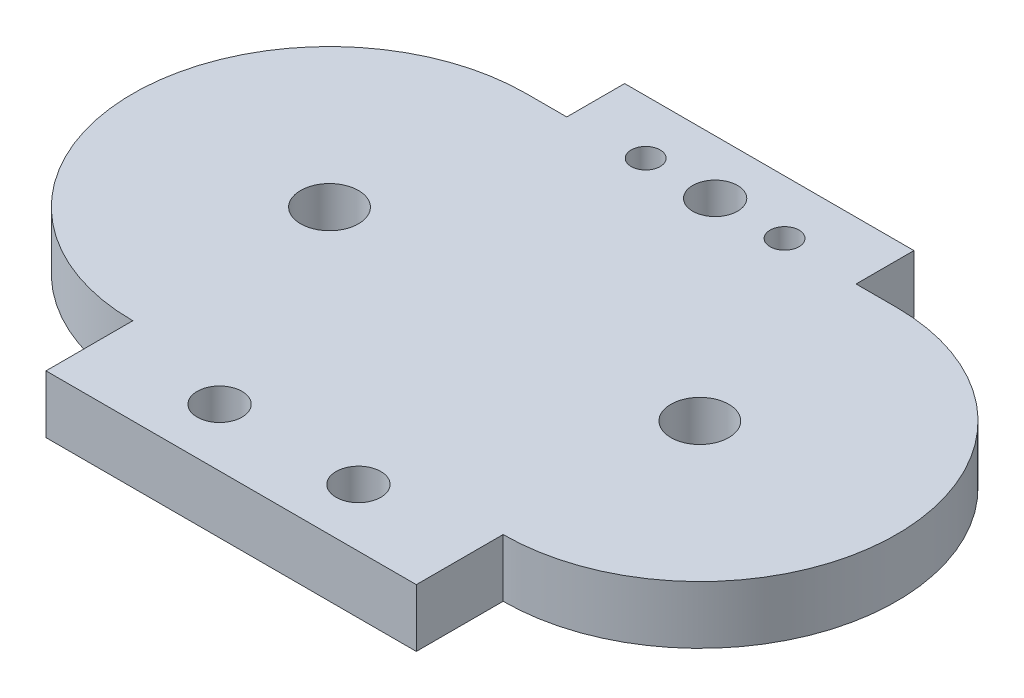
ISO-10303-21;
HEADER;
FILE_DESCRIPTION(('STEP AP214'),'2;1');
FILE_NAME('part.step','',(''),(''),'','','');
FILE_SCHEMA(('AUTOMOTIVE_DESIGN { 1 0 10303 214 1 1 1 1 }'));
ENDSEC;
DATA;
#1=APPLICATION_CONTEXT('core data for automotive mechanical design processes');
#2=APPLICATION_PROTOCOL_DEFINITION('international standard','automotive_design',2000,#1);
#3=PRODUCT_CONTEXT('',#1,'mechanical');
#4=PRODUCT('Part','Part','',(#3));
#5=PRODUCT_RELATED_PRODUCT_CATEGORY('part','',(#4));
#6=PRODUCT_DEFINITION_FORMATION('','',#4);
#7=PRODUCT_DEFINITION_CONTEXT('part definition',#1,'design');
#8=PRODUCT_DEFINITION('design','',#6,#7);
#9=PRODUCT_DEFINITION_SHAPE('','',#8);
#10=(LENGTH_UNIT() NAMED_UNIT(*) SI_UNIT(.MILLI.,.METRE.));
#11=(NAMED_UNIT(*) PLANE_ANGLE_UNIT() SI_UNIT($,.RADIAN.));
#12=(NAMED_UNIT(*) SI_UNIT($,.STERADIAN.) SOLID_ANGLE_UNIT());
#13=UNCERTAINTY_MEASURE_WITH_UNIT(LENGTH_MEASURE(1.E-05),#10,'distance_accuracy_value','');
#14=(GEOMETRIC_REPRESENTATION_CONTEXT(3) GLOBAL_UNCERTAINTY_ASSIGNED_CONTEXT((#13)) GLOBAL_UNIT_ASSIGNED_CONTEXT((#10,
#11,#12)) REPRESENTATION_CONTEXT('',''));
#15=CARTESIAN_POINT('',(0.,0.,0.));
#16=DIRECTION('',(0.,0.,1.));
#17=DIRECTION('',(1.,0.,0.));
#18=AXIS2_PLACEMENT_3D('',#15,#16,#17);
#19=CARTESIAN_POINT('',(20.32,6.35,0.));
#20=DIRECTION('',(0.,-1.,0.));
#21=DIRECTION('',(0.,0.,-1.));
#22=AXIS2_PLACEMENT_3D('',#19,#20,#21);
#23=CYLINDRICAL_SURFACE('',#22,21.59);
#24=CARTESIAN_POINT('',(20.32,0.,0.));
#25=DIRECTION('',(0.,1.,0.));
#26=DIRECTION('',(0.,0.,1.));
#27=AXIS2_PLACEMENT_3D('',#24,#25,#26);
#28=CIRCLE('',#27,21.59);
#29=CARTESIAN_POINT('',(20.32,0.,-21.59));
#30=VERTEX_POINT('',#29);
#31=CARTESIAN_POINT('',(20.32,0.,21.59));
#32=VERTEX_POINT('',#31);
#33=EDGE_CURVE('E173',#30,#32,#28,.F.);
#34=ORIENTED_EDGE('',*,*,#33,.F.);
#35=DIRECTION('',(0.,-1.,0.));
#36=VECTOR('',#35,1.);
#37=CARTESIAN_POINT('',(20.32,6.35,-21.59));
#38=LINE('',#37,#36);
#39=CARTESIAN_POINT('',(20.32,6.35,-21.59));
#40=VERTEX_POINT('',#39);
#41=EDGE_CURVE('E11',#40,#30,#38,.T.);
#42=ORIENTED_EDGE('',*,*,#41,.F.);
#43=CARTESIAN_POINT('',(20.32,6.35,0.));
#44=DIRECTION('',(0.,1.,0.));
#45=DIRECTION('',(0.,0.,1.));
#46=AXIS2_PLACEMENT_3D('',#43,#44,#45);
#47=CIRCLE('',#46,21.59);
#48=CARTESIAN_POINT('',(20.32,6.35,21.59));
#49=VERTEX_POINT('',#48);
#50=EDGE_CURVE('E223',#40,#49,#47,.F.);
#51=ORIENTED_EDGE('',*,*,#50,.T.);
#52=DIRECTION('',(0.,-1.,0.));
#53=VECTOR('',#52,1.);
#54=CARTESIAN_POINT('',(20.32,6.35,21.59));
#55=LINE('',#54,#53);
#56=EDGE_CURVE('E103',#49,#32,#55,.T.);
#57=ORIENTED_EDGE('',*,*,#56,.T.);
#58=EDGE_LOOP('',(#34,#42,#51,#57));
#59=FACE_BOUND('',#58,.T.);
#60=ADVANCED_FACE('F45',(#59),#23,.T.);
#61=CARTESIAN_POINT('',(0.,6.35,-21.59));
#62=DIRECTION('',(0.,0.,1.));
#63=DIRECTION('',(1.,0.,0.));
#64=AXIS2_PLACEMENT_3D('',#61,#62,#63);
#65=PLANE('',#64);
#66=DIRECTION('',(-1.,0.,0.));
#67=VECTOR('',#66,1.);
#68=CARTESIAN_POINT('',(0.,0.,-21.59));
#69=LINE('',#68,#67);
#70=CARTESIAN_POINT('',(15.875,0.,-21.59));
#71=VERTEX_POINT('',#70);
#72=EDGE_CURVE('E177',#30,#71,#69,.T.);
#73=ORIENTED_EDGE('',*,*,#72,.T.);
#74=DIRECTION('',(0.,-1.,0.));
#75=VECTOR('',#74,1.);
#76=CARTESIAN_POINT('',(15.875,6.35,-21.59));
#77=LINE('',#76,#75);
#78=CARTESIAN_POINT('',(15.875,6.35,-21.59));
#79=VERTEX_POINT('',#78);
#80=EDGE_CURVE('E54',#79,#71,#77,.T.);
#81=ORIENTED_EDGE('',*,*,#80,.F.);
#82=DIRECTION('',(-1.,0.,0.));
#83=VECTOR('',#82,1.);
#84=CARTESIAN_POINT('',(0.,6.35,-21.59));
#85=LINE('',#84,#83);
#86=EDGE_CURVE('E271',#40,#79,#85,.T.);
#87=ORIENTED_EDGE('',*,*,#86,.F.);
#88=ORIENTED_EDGE('',*,*,#41,.T.);
#89=EDGE_LOOP('',(#73,#81,#87,#88));
#90=FACE_BOUND('',#89,.T.);
#91=ADVANCED_FACE('F295',(#90),#65,.F.);
#92=CARTESIAN_POINT('',(15.875,6.35,0.));
#93=DIRECTION('',(-1.,0.,0.));
#94=DIRECTION('',(0.,0.,1.));
#95=AXIS2_PLACEMENT_3D('',#92,#93,#94);
#96=PLANE('',#95);
#97=DIRECTION('',(0.,0.,-1.));
#98=VECTOR('',#97,1.);
#99=CARTESIAN_POINT('',(15.875,0.,0.));
#100=LINE('',#99,#98);
#101=CARTESIAN_POINT('',(15.875,0.,-27.94));
#102=VERTEX_POINT('',#101);
#103=EDGE_CURVE('E181',#71,#102,#100,.T.);
#104=ORIENTED_EDGE('',*,*,#103,.T.);
#105=DIRECTION('',(0.,-1.,0.));
#106=VECTOR('',#105,1.);
#107=CARTESIAN_POINT('',(15.875,6.35,-27.94));
#108=LINE('',#107,#106);
#109=CARTESIAN_POINT('',(15.875,6.35,-27.94));
#110=VERTEX_POINT('',#109);
#111=EDGE_CURVE('E239',#110,#102,#108,.T.);
#112=ORIENTED_EDGE('',*,*,#111,.F.);
#113=DIRECTION('',(0.,0.,-1.));
#114=VECTOR('',#113,1.);
#115=CARTESIAN_POINT('',(15.875,6.35,0.));
#116=LINE('',#115,#114);
#117=EDGE_CURVE('E249',#79,#110,#116,.T.);
#118=ORIENTED_EDGE('',*,*,#117,.F.);
#119=ORIENTED_EDGE('',*,*,#80,.T.);
#120=EDGE_LOOP('',(#104,#112,#118,#119));
#121=FACE_BOUND('',#120,.T.);
#122=ADVANCED_FACE('F247',(#121),#96,.F.);
#123=CARTESIAN_POINT('',(0.,6.35,-27.94));
#124=DIRECTION('',(0.,0.,-1.));
#125=DIRECTION('',(-1.,0.,0.));
#126=AXIS2_PLACEMENT_3D('',#123,#124,#125);
#127=PLANE('',#126);
#128=DIRECTION('',(1.,0.,0.));
#129=VECTOR('',#128,1.);
#130=CARTESIAN_POINT('',(0.,0.,-27.94));
#131=LINE('',#130,#129);
#132=CARTESIAN_POINT('',(-15.875,0.,-27.94));
#133=VERTEX_POINT('',#132);
#134=EDGE_CURVE('E185',#133,#102,#131,.T.);
#135=ORIENTED_EDGE('',*,*,#134,.F.);
#136=DIRECTION('',(0.,-1.,0.));
#137=VECTOR('',#136,1.);
#138=CARTESIAN_POINT('',(-15.875,6.35,-27.94));
#139=LINE('',#138,#137);
#140=CARTESIAN_POINT('',(-15.875,6.35,-27.94));
#141=VERTEX_POINT('',#140);
#142=EDGE_CURVE('E236',#141,#133,#139,.T.);
#143=ORIENTED_EDGE('',*,*,#142,.F.);
#144=DIRECTION('',(1.,0.,0.));
#145=VECTOR('',#144,1.);
#146=CARTESIAN_POINT('',(0.,6.35,-27.94));
#147=LINE('',#146,#145);
#148=EDGE_CURVE('E261',#141,#110,#147,.T.);
#149=ORIENTED_EDGE('',*,*,#148,.T.);
#150=ORIENTED_EDGE('',*,*,#111,.T.);
#151=EDGE_LOOP('',(#135,#143,#149,#150));
#152=FACE_BOUND('',#151,.T.);
#153=ADVANCED_FACE('F258',(#152),#127,.T.);
#154=CARTESIAN_POINT('',(-15.875,6.35,0.));
#155=DIRECTION('',(-1.,0.,0.));
#156=DIRECTION('',(0.,0.,1.));
#157=AXIS2_PLACEMENT_3D('',#154,#155,#156);
#158=PLANE('',#157);
#159=DIRECTION('',(0.,0.,-1.));
#160=VECTOR('',#159,1.);
#161=CARTESIAN_POINT('',(-15.875,0.,0.));
#162=LINE('',#161,#160);
#163=CARTESIAN_POINT('',(-15.875,0.,-21.59));
#164=VERTEX_POINT('',#163);
#165=EDGE_CURVE('E189',#164,#133,#162,.T.);
#166=ORIENTED_EDGE('',*,*,#165,.F.);
#167=DIRECTION('',(0.,-1.,0.));
#168=VECTOR('',#167,1.);
#169=CARTESIAN_POINT('',(-15.875,6.35,-21.59));
#170=LINE('',#169,#168);
#171=CARTESIAN_POINT('',(-15.875,6.35,-21.59));
#172=VERTEX_POINT('',#171);
#173=EDGE_CURVE('E233',#172,#164,#170,.T.);
#174=ORIENTED_EDGE('',*,*,#173,.F.);
#175=DIRECTION('',(0.,0.,-1.));
#176=VECTOR('',#175,1.);
#177=CARTESIAN_POINT('',(-15.875,6.35,0.));
#178=LINE('',#177,#176);
#179=EDGE_CURVE('E265',#172,#141,#178,.T.);
#180=ORIENTED_EDGE('',*,*,#179,.T.);
#181=ORIENTED_EDGE('',*,*,#142,.T.);
#182=EDGE_LOOP('',(#166,#174,#180,#181));
#183=FACE_BOUND('',#182,.T.);
#184=ADVANCED_FACE('F282',(#183),#158,.T.);
#185=CARTESIAN_POINT('',(0.,6.35,-21.59));
#186=DIRECTION('',(0.,0.,-1.));
#187=DIRECTION('',(-1.,0.,0.));
#188=AXIS2_PLACEMENT_3D('',#185,#186,#187);
#189=PLANE('',#188);
#190=DIRECTION('',(1.,0.,0.));
#191=VECTOR('',#190,1.);
#192=CARTESIAN_POINT('',(0.,0.,-21.59));
#193=LINE('',#192,#191);
#194=CARTESIAN_POINT('',(-20.32,0.,-21.59));
#195=VERTEX_POINT('',#194);
#196=EDGE_CURVE('E193',#195,#164,#193,.T.);
#197=ORIENTED_EDGE('',*,*,#196,.F.);
#198=DIRECTION('',(0.,-1.,0.));
#199=VECTOR('',#198,1.);
#200=CARTESIAN_POINT('',(-20.32,6.35,-21.59));
#201=LINE('',#200,#199);
#202=CARTESIAN_POINT('',(-20.32,6.35,-21.59));
#203=VERTEX_POINT('',#202);
#204=EDGE_CURVE('E230',#203,#195,#201,.T.);
#205=ORIENTED_EDGE('',*,*,#204,.F.);
#206=DIRECTION('',(1.,0.,0.));
#207=VECTOR('',#206,1.);
#208=CARTESIAN_POINT('',(0.,6.35,-21.59));
#209=LINE('',#208,#207);
#210=EDGE_CURVE('E269',#203,#172,#209,.T.);
#211=ORIENTED_EDGE('',*,*,#210,.T.);
#212=ORIENTED_EDGE('',*,*,#173,.T.);
#213=EDGE_LOOP('',(#197,#205,#211,#212));
#214=FACE_BOUND('',#213,.T.);
#215=ADVANCED_FACE('F280',(#214),#189,.T.);
#216=CARTESIAN_POINT('',(-20.32,6.35,0.));
#217=DIRECTION('',(0.,-1.,0.));
#218=DIRECTION('',(0.,0.,-1.));
#219=AXIS2_PLACEMENT_3D('',#216,#217,#218);
#220=CYLINDRICAL_SURFACE('',#219,21.59);
#221=CARTESIAN_POINT('',(-20.32,0.,0.));
#222=DIRECTION('',(0.,1.,0.));
#223=DIRECTION('',(0.,0.,1.));
#224=AXIS2_PLACEMENT_3D('',#221,#222,#223);
#225=CIRCLE('',#224,21.59);
#226=CARTESIAN_POINT('',(-20.32,0.,21.59));
#227=VERTEX_POINT('',#226);
#228=EDGE_CURVE('E197',#195,#227,#225,.T.);
#229=ORIENTED_EDGE('',*,*,#228,.T.);
#230=DIRECTION('',(0.,-1.,0.));
#231=VECTOR('',#230,1.);
#232=CARTESIAN_POINT('',(-20.32,6.35,21.59));
#233=LINE('',#232,#231);
#234=CARTESIAN_POINT('',(-20.32,6.35,21.59));
#235=VERTEX_POINT('',#234);
#236=EDGE_CURVE('E147',#235,#227,#233,.T.);
#237=ORIENTED_EDGE('',*,*,#236,.F.);
#238=CARTESIAN_POINT('',(-20.32,6.35,0.));
#239=DIRECTION('',(0.,1.,0.));
#240=DIRECTION('',(0.,0.,1.));
#241=AXIS2_PLACEMENT_3D('',#238,#239,#240);
#242=CIRCLE('',#241,21.59);
#243=EDGE_CURVE('E136',#203,#235,#242,.T.);
#244=ORIENTED_EDGE('',*,*,#243,.F.);
#245=ORIENTED_EDGE('',*,*,#204,.T.);
#246=EDGE_LOOP('',(#229,#237,#244,#245));
#247=FACE_BOUND('',#246,.T.);
#248=ADVANCED_FACE('F285',(#247),#220,.T.);
#249=CARTESIAN_POINT('',(-20.32,6.35,0.));
#250=DIRECTION('',(1.,0.,0.));
#251=DIRECTION('',(0.,0.,-1.));
#252=AXIS2_PLACEMENT_3D('',#249,#250,#251);
#253=PLANE('',#252);
#254=DIRECTION('',(0.,0.,1.));
#255=VECTOR('',#254,1.);
#256=CARTESIAN_POINT('',(-20.32,0.,0.));
#257=LINE('',#256,#255);
#258=CARTESIAN_POINT('',(-20.32,0.,31.115));
#259=VERTEX_POINT('',#258);
#260=EDGE_CURVE('E145',#227,#259,#257,.T.);
#261=ORIENTED_EDGE('',*,*,#260,.T.);
#262=DIRECTION('',(0.,-1.,0.));
#263=VECTOR('',#262,1.);
#264=CARTESIAN_POINT('',(-20.32,6.35,31.115));
#265=LINE('',#264,#263);
#266=CARTESIAN_POINT('',(-20.32,6.35,31.115));
#267=VERTEX_POINT('',#266);
#268=EDGE_CURVE('E142',#267,#259,#265,.T.);
#269=ORIENTED_EDGE('',*,*,#268,.F.);
#270=DIRECTION('',(0.,0.,1.));
#271=VECTOR('',#270,1.);
#272=CARTESIAN_POINT('',(-20.32,6.35,0.));
#273=LINE('',#272,#271);
#274=EDGE_CURVE('E128',#235,#267,#273,.T.);
#275=ORIENTED_EDGE('',*,*,#274,.F.);
#276=ORIENTED_EDGE('',*,*,#236,.T.);
#277=EDGE_LOOP('',(#261,#269,#275,#276));
#278=FACE_BOUND('',#277,.T.);
#279=ADVANCED_FACE('F143',(#278),#253,.F.);
#280=CARTESIAN_POINT('',(0.,6.35,31.115));
#281=DIRECTION('',(0.,0.,-1.));
#282=DIRECTION('',(-1.,0.,0.));
#283=AXIS2_PLACEMENT_3D('',#280,#281,#282);
#284=PLANE('',#283);
#285=DIRECTION('',(1.,0.,0.));
#286=VECTOR('',#285,1.);
#287=CARTESIAN_POINT('',(0.,0.,31.115));
#288=LINE('',#287,#286);
#289=CARTESIAN_POINT('',(20.32,0.,31.115));
#290=VERTEX_POINT('',#289);
#291=EDGE_CURVE('E96',#259,#290,#288,.T.);
#292=ORIENTED_EDGE('',*,*,#291,.T.);
#293=DIRECTION('',(0.,-1.,0.));
#294=VECTOR('',#293,1.);
#295=CARTESIAN_POINT('',(20.32,6.35,31.115));
#296=LINE('',#295,#294);
#297=CARTESIAN_POINT('',(20.32,6.35,31.115));
#298=VERTEX_POINT('',#297);
#299=EDGE_CURVE('E148',#298,#290,#296,.T.);
#300=ORIENTED_EDGE('',*,*,#299,.F.);
#301=DIRECTION('',(1.,0.,0.));
#302=VECTOR('',#301,1.);
#303=CARTESIAN_POINT('',(0.,6.35,31.115));
#304=LINE('',#303,#302);
#305=EDGE_CURVE('E133',#267,#298,#304,.T.);
#306=ORIENTED_EDGE('',*,*,#305,.F.);
#307=ORIENTED_EDGE('',*,*,#268,.T.);
#308=EDGE_LOOP('',(#292,#300,#306,#307));
#309=FACE_BOUND('',#308,.T.);
#310=ADVANCED_FACE('F150',(#309),#284,.F.);
#311=CARTESIAN_POINT('',(20.32,6.35,0.));
#312=DIRECTION('',(0.,-1.,0.));
#313=DIRECTION('',(0.,0.,-1.));
#314=AXIS2_PLACEMENT_3D('',#311,#312,#313);
#315=CYLINDRICAL_SURFACE('',#314,3.175);
#316=CARTESIAN_POINT('',(20.32,6.35,0.));
#317=DIRECTION('',(0.,1.,0.));
#318=DIRECTION('',(0.,0.,1.));
#319=AXIS2_PLACEMENT_3D('',#316,#317,#318);
#320=CIRCLE('',#319,3.175);
#321=CARTESIAN_POINT('',(20.32,6.35,3.175));
#322=VERTEX_POINT('',#321);
#323=EDGE_CURVE('E165',#322,#322,#320,.T.);
#324=ORIENTED_EDGE('',*,*,#323,.T.);
#325=EDGE_LOOP('',(#324));
#326=FACE_BOUND('',#325,.T.);
#327=CARTESIAN_POINT('',(20.32,0.,0.));
#328=DIRECTION('',(0.,1.,0.));
#329=DIRECTION('',(0.,0.,1.));
#330=AXIS2_PLACEMENT_3D('',#327,#328,#329);
#331=CIRCLE('',#330,3.175);
#332=CARTESIAN_POINT('',(20.32,0.,3.175));
#333=VERTEX_POINT('',#332);
#334=EDGE_CURVE('E215',#333,#333,#331,.T.);
#335=ORIENTED_EDGE('',*,*,#334,.F.);
#336=EDGE_LOOP('',(#335));
#337=FACE_BOUND('',#336,.T.);
#338=ADVANCED_FACE('F359',(#326,#337),#315,.F.);
#339=CARTESIAN_POINT('',(7.61999999999991,6.35,-21.9970452561247));
#340=DIRECTION('',(0.,-1.,0.));
#341=DIRECTION('',(0.,0.,-1.));
#342=AXIS2_PLACEMENT_3D('',#339,#340,#341);
#343=CYLINDRICAL_SURFACE('',#342,1.5875);
#344=CARTESIAN_POINT('',(7.61999999999991,6.35,-21.9970452561247));
#345=DIRECTION('',(0.,1.,0.));
#346=DIRECTION('',(0.,0.,1.));
#347=AXIS2_PLACEMENT_3D('',#344,#345,#346);
#348=CIRCLE('',#347,1.5875);
#349=CARTESIAN_POINT('',(7.61999999999991,6.35,-20.4095452561247));
#350=VERTEX_POINT('',#349);
#351=EDGE_CURVE('E161',#350,#350,#348,.T.);
#352=ORIENTED_EDGE('',*,*,#351,.T.);
#353=EDGE_LOOP('',(#352));
#354=FACE_BOUND('',#353,.T.);
#355=CARTESIAN_POINT('',(7.61999999999991,0.,-21.9970452561247));
#356=DIRECTION('',(0.,1.,0.));
#357=DIRECTION('',(0.,0.,1.));
#358=AXIS2_PLACEMENT_3D('',#355,#356,#357);
#359=CIRCLE('',#358,1.5875);
#360=CARTESIAN_POINT('',(7.61999999999991,0.,-20.4095452561247));
#361=VERTEX_POINT('',#360);
#362=EDGE_CURVE('E211',#361,#361,#359,.T.);
#363=ORIENTED_EDGE('',*,*,#362,.F.);
#364=EDGE_LOOP('',(#363));
#365=FACE_BOUND('',#364,.T.);
#366=ADVANCED_FACE('F362',(#354,#365),#343,.F.);
#367=CARTESIAN_POINT('',(-20.32,6.35,0.));
#368=DIRECTION('',(0.,-1.,0.));
#369=DIRECTION('',(0.,0.,-1.));
#370=AXIS2_PLACEMENT_3D('',#367,#368,#369);
#371=CYLINDRICAL_SURFACE('',#370,3.175);
#372=CARTESIAN_POINT('',(-20.32,6.35,0.));
#373=DIRECTION('',(0.,1.,0.));
#374=DIRECTION('',(0.,0.,1.));
#375=AXIS2_PLACEMENT_3D('',#372,#373,#374);
#376=CIRCLE('',#375,3.175);
#377=CARTESIAN_POINT('',(-20.32,6.35,3.17500000000001));
#378=VERTEX_POINT('',#377);
#379=EDGE_CURVE('E154',#378,#378,#376,.F.);
#380=ORIENTED_EDGE('',*,*,#379,.F.);
#381=EDGE_LOOP('',(#380));
#382=FACE_BOUND('',#381,.T.);
#383=CARTESIAN_POINT('',(-20.32,0.,0.));
#384=DIRECTION('',(0.,1.,0.));
#385=DIRECTION('',(0.,0.,1.));
#386=AXIS2_PLACEMENT_3D('',#383,#384,#385);
#387=CIRCLE('',#386,3.175);
#388=CARTESIAN_POINT('',(-20.32,0.,3.17500000000001));
#389=VERTEX_POINT('',#388);
#390=EDGE_CURVE('E207',#389,#389,#387,.F.);
#391=ORIENTED_EDGE('',*,*,#390,.T.);
#392=EDGE_LOOP('',(#391));
#393=FACE_BOUND('',#392,.T.);
#394=ADVANCED_FACE('F366',(#382,#393),#371,.F.);
#395=CARTESIAN_POINT('',(20.32,6.35,0.));
#396=DIRECTION('',(-1.,0.,0.));
#397=DIRECTION('',(0.,0.,1.));
#398=AXIS2_PLACEMENT_3D('',#395,#396,#397);
#399=PLANE('',#398);
#400=DIRECTION('',(0.,0.,-1.));
#401=VECTOR('',#400,1.);
#402=CARTESIAN_POINT('',(20.32,0.,0.));
#403=LINE('',#402,#401);
#404=EDGE_CURVE('E204',#290,#32,#403,.T.);
#405=ORIENTED_EDGE('',*,*,#404,.T.);
#406=ORIENTED_EDGE('',*,*,#56,.F.);
#407=DIRECTION('',(0.,0.,-1.));
#408=VECTOR('',#407,1.);
#409=CARTESIAN_POINT('',(20.32,6.35,0.));
#410=LINE('',#409,#408);
#411=EDGE_CURVE('E62',#298,#49,#410,.T.);
#412=ORIENTED_EDGE('',*,*,#411,.F.);
#413=ORIENTED_EDGE('',*,*,#299,.T.);
#414=EDGE_LOOP('',(#405,#406,#412,#413));
#415=FACE_BOUND('',#414,.T.);
#416=ADVANCED_FACE('F301',(#415),#399,.F.);
#417=CARTESIAN_POINT('',(-7.6199999999999,6.35,-21.9970452561247));
#418=DIRECTION('',(0.,-1.,0.));
#419=DIRECTION('',(0.,0.,-1.));
#420=AXIS2_PLACEMENT_3D('',#417,#418,#419);
#421=CYLINDRICAL_SURFACE('',#420,1.5875);
#422=CARTESIAN_POINT('',(-7.6199999999999,6.35,-21.9970452561247));
#423=DIRECTION('',(0.,1.,0.));
#424=DIRECTION('',(0.,0.,1.));
#425=AXIS2_PLACEMENT_3D('',#422,#423,#424);
#426=CIRCLE('',#425,1.5875);
#427=CARTESIAN_POINT('',(-7.6199999999999,6.35,-20.4095452561247));
#428=VERTEX_POINT('',#427);
#429=EDGE_CURVE('E169',#428,#428,#426,.F.);
#430=ORIENTED_EDGE('',*,*,#429,.F.);
#431=EDGE_LOOP('',(#430));
#432=FACE_BOUND('',#431,.T.);
#433=CARTESIAN_POINT('',(-7.6199999999999,0.,-21.9970452561247));
#434=DIRECTION('',(0.,1.,0.));
#435=DIRECTION('',(0.,0.,1.));
#436=AXIS2_PLACEMENT_3D('',#433,#434,#435);
#437=CIRCLE('',#436,1.5875);
#438=CARTESIAN_POINT('',(-7.6199999999999,0.,-20.4095452561247));
#439=VERTEX_POINT('',#438);
#440=EDGE_CURVE('E219',#439,#439,#437,.F.);
#441=ORIENTED_EDGE('',*,*,#440,.T.);
#442=EDGE_LOOP('',(#441));
#443=FACE_BOUND('',#442,.T.);
#444=ADVANCED_FACE('F334',(#432,#443),#421,.F.);
#445=CARTESIAN_POINT('',(0.,6.35,0.));
#446=DIRECTION('',(0.,1.,0.));
#447=DIRECTION('',(0.,0.,1.));
#448=AXIS2_PLACEMENT_3D('',#445,#446,#447);
#449=PLANE('',#448);
#450=CARTESIAN_POINT('',(0.,6.35,-21.9970452561247));
#451=DIRECTION('',(0.,1.,0.));
#452=DIRECTION('',(0.,0.,1.));
#453=AXIS2_PLACEMENT_3D('',#450,#451,#452);
#454=CIRCLE('',#453,2.45745);
#455=CARTESIAN_POINT('',(0.,6.35,-19.5395952561247));
#456=VERTEX_POINT('',#455);
#457=EDGE_CURVE('E325',#456,#456,#454,.T.);
#458=ORIENTED_EDGE('',*,*,#457,.F.);
#459=EDGE_LOOP('',(#458));
#460=FACE_BOUND('',#459,.T.);
#461=CARTESIAN_POINT('',(-7.6199999999999,6.35,24.765));
#462=DIRECTION('',(0.,1.,0.));
#463=DIRECTION('',(0.,0.,1.));
#464=AXIS2_PLACEMENT_3D('',#461,#462,#463);
#465=CIRCLE('',#464,2.45745);
#466=CARTESIAN_POINT('',(-7.6199999999999,6.35,27.22245));
#467=VERTEX_POINT('',#466);
#468=EDGE_CURVE('E317',#467,#467,#465,.T.);
#469=ORIENTED_EDGE('',*,*,#468,.F.);
#470=EDGE_LOOP('',(#469));
#471=FACE_BOUND('',#470,.T.);
#472=CARTESIAN_POINT('',(7.61999999999991,6.35,24.765));
#473=DIRECTION('',(0.,1.,0.));
#474=DIRECTION('',(0.,0.,1.));
#475=AXIS2_PLACEMENT_3D('',#472,#473,#474);
#476=CIRCLE('',#475,2.45745);
#477=CARTESIAN_POINT('',(7.61999999999991,6.35,27.22245));
#478=VERTEX_POINT('',#477);
#479=EDGE_CURVE('E309',#478,#478,#476,.T.);
#480=ORIENTED_EDGE('',*,*,#479,.F.);
#481=EDGE_LOOP('',(#480));
#482=FACE_BOUND('',#481,.T.);
#483=ORIENTED_EDGE('',*,*,#50,.F.);
#484=ORIENTED_EDGE('',*,*,#86,.T.);
#485=ORIENTED_EDGE('',*,*,#117,.T.);
#486=ORIENTED_EDGE('',*,*,#148,.F.);
#487=ORIENTED_EDGE('',*,*,#179,.F.);
#488=ORIENTED_EDGE('',*,*,#210,.F.);
#489=ORIENTED_EDGE('',*,*,#243,.T.);
#490=ORIENTED_EDGE('',*,*,#274,.T.);
#491=ORIENTED_EDGE('',*,*,#305,.T.);
#492=ORIENTED_EDGE('',*,*,#411,.T.);
#493=EDGE_LOOP('',(#483,#484,#485,#486,#487,#488,#489,#490,#491,#492));
#494=FACE_BOUND('',#493,.T.);
#495=ORIENTED_EDGE('',*,*,#379,.T.);
#496=EDGE_LOOP('',(#495));
#497=FACE_BOUND('',#496,.T.);
#498=ORIENTED_EDGE('',*,*,#351,.F.);
#499=EDGE_LOOP('',(#498));
#500=FACE_BOUND('',#499,.T.);
#501=ORIENTED_EDGE('',*,*,#323,.F.);
#502=EDGE_LOOP('',(#501));
#503=FACE_BOUND('',#502,.T.);
#504=ORIENTED_EDGE('',*,*,#429,.T.);
#505=EDGE_LOOP('',(#504));
#506=FACE_BOUND('',#505,.T.);
#507=ADVANCED_FACE('F130',(#460,#471,#482,#494,#497,#500,#503,#506),#449,.T.);
#508=CARTESIAN_POINT('',(0.,0.,0.));
#509=DIRECTION('',(0.,1.,0.));
#510=DIRECTION('',(0.,0.,1.));
#511=AXIS2_PLACEMENT_3D('',#508,#509,#510);
#512=PLANE('',#511);
#513=CARTESIAN_POINT('',(0.,0.,-21.9970452561247));
#514=DIRECTION('',(0.,1.,0.));
#515=DIRECTION('',(0.,0.,1.));
#516=AXIS2_PLACEMENT_3D('',#513,#514,#515);
#517=CIRCLE('',#516,2.45745);
#518=CARTESIAN_POINT('',(0.,0.,-19.5395952561247));
#519=VERTEX_POINT('',#518);
#520=EDGE_CURVE('E321',#519,#519,#517,.T.);
#521=ORIENTED_EDGE('',*,*,#520,.T.);
#522=EDGE_LOOP('',(#521));
#523=FACE_BOUND('',#522,.T.);
#524=CARTESIAN_POINT('',(-7.6199999999999,0.,24.765));
#525=DIRECTION('',(0.,1.,0.));
#526=DIRECTION('',(0.,0.,1.));
#527=AXIS2_PLACEMENT_3D('',#524,#525,#526);
#528=CIRCLE('',#527,2.45745);
#529=CARTESIAN_POINT('',(-7.6199999999999,0.,27.22245));
#530=VERTEX_POINT('',#529);
#531=EDGE_CURVE('E313',#530,#530,#528,.T.);
#532=ORIENTED_EDGE('',*,*,#531,.T.);
#533=EDGE_LOOP('',(#532));
#534=FACE_BOUND('',#533,.T.);
#535=CARTESIAN_POINT('',(7.61999999999991,0.,24.765));
#536=DIRECTION('',(0.,1.,0.));
#537=DIRECTION('',(0.,0.,1.));
#538=AXIS2_PLACEMENT_3D('',#535,#536,#537);
#539=CIRCLE('',#538,2.45745);
#540=CARTESIAN_POINT('',(7.61999999999991,0.,27.22245));
#541=VERTEX_POINT('',#540);
#542=EDGE_CURVE('E178',#541,#541,#539,.T.);
#543=ORIENTED_EDGE('',*,*,#542,.T.);
#544=EDGE_LOOP('',(#543));
#545=FACE_BOUND('',#544,.T.);
#546=ORIENTED_EDGE('',*,*,#33,.T.);
#547=ORIENTED_EDGE('',*,*,#404,.F.);
#548=ORIENTED_EDGE('',*,*,#291,.F.);
#549=ORIENTED_EDGE('',*,*,#260,.F.);
#550=ORIENTED_EDGE('',*,*,#228,.F.);
#551=ORIENTED_EDGE('',*,*,#196,.T.);
#552=ORIENTED_EDGE('',*,*,#165,.T.);
#553=ORIENTED_EDGE('',*,*,#134,.T.);
#554=ORIENTED_EDGE('',*,*,#103,.F.);
#555=ORIENTED_EDGE('',*,*,#72,.F.);
#556=EDGE_LOOP('',(#546,#547,#548,#549,#550,#551,#552,#553,#554,#555));
#557=FACE_BOUND('',#556,.T.);
#558=ORIENTED_EDGE('',*,*,#390,.F.);
#559=EDGE_LOOP('',(#558));
#560=FACE_BOUND('',#559,.T.);
#561=ORIENTED_EDGE('',*,*,#362,.T.);
#562=EDGE_LOOP('',(#561));
#563=FACE_BOUND('',#562,.T.);
#564=ORIENTED_EDGE('',*,*,#334,.T.);
#565=EDGE_LOOP('',(#564));
#566=FACE_BOUND('',#565,.T.);
#567=ORIENTED_EDGE('',*,*,#440,.F.);
#568=EDGE_LOOP('',(#567));
#569=FACE_BOUND('',#568,.T.);
#570=ADVANCED_FACE('F253',(#523,#534,#545,#557,#560,#563,#566,#569),#512,.F.);
#571=CARTESIAN_POINT('',(7.61999999999991,6.35,24.765));
#572=DIRECTION('',(0.,1.,0.));
#573=DIRECTION('',(0.,0.,1.));
#574=AXIS2_PLACEMENT_3D('',#571,#572,#573);
#575=CYLINDRICAL_SURFACE('',#574,2.45745);
#576=ORIENTED_EDGE('',*,*,#542,.F.);
#577=EDGE_LOOP('',(#576));
#578=FACE_BOUND('',#577,.T.);
#579=ORIENTED_EDGE('',*,*,#479,.T.);
#580=EDGE_LOOP('',(#579));
#581=FACE_BOUND('',#580,.T.);
#582=ADVANCED_FACE('F340',(#578,#581),#575,.F.);
#583=CARTESIAN_POINT('',(-7.6199999999999,6.35,24.765));
#584=DIRECTION('',(0.,1.,0.));
#585=DIRECTION('',(0.,0.,1.));
#586=AXIS2_PLACEMENT_3D('',#583,#584,#585);
#587=CYLINDRICAL_SURFACE('',#586,2.45745);
#588=ORIENTED_EDGE('',*,*,#531,.F.);
#589=EDGE_LOOP('',(#588));
#590=FACE_BOUND('',#589,.T.);
#591=ORIENTED_EDGE('',*,*,#468,.T.);
#592=EDGE_LOOP('',(#591));
#593=FACE_BOUND('',#592,.T.);
#594=ADVANCED_FACE('F342',(#590,#593),#587,.F.);
#595=CARTESIAN_POINT('',(0.,6.35,-21.9970452561247));
#596=DIRECTION('',(0.,1.,0.));
#597=DIRECTION('',(0.,0.,1.));
#598=AXIS2_PLACEMENT_3D('',#595,#596,#597);
#599=CYLINDRICAL_SURFACE('',#598,2.45745);
#600=ORIENTED_EDGE('',*,*,#520,.F.);
#601=EDGE_LOOP('',(#600));
#602=FACE_BOUND('',#601,.T.);
#603=ORIENTED_EDGE('',*,*,#457,.T.);
#604=EDGE_LOOP('',(#603));
#605=FACE_BOUND('',#604,.T.);
#606=ADVANCED_FACE('F330',(#602,#605),#599,.F.);
#607=CLOSED_SHELL('',(#60,#91,#122,#153,#184,#215,#248,#279,#310,#338,#366,#394,#416,#444,#507,
#570,#582,#594,#606));
#608=MANIFOLD_SOLID_BREP('B2',#607);
#609=ADVANCED_BREP_SHAPE_REPRESENTATION('',(#18,#608),#14);
#610=SHAPE_DEFINITION_REPRESENTATION(#9,#609);
ENDSEC;
END-ISO-10303-21;
